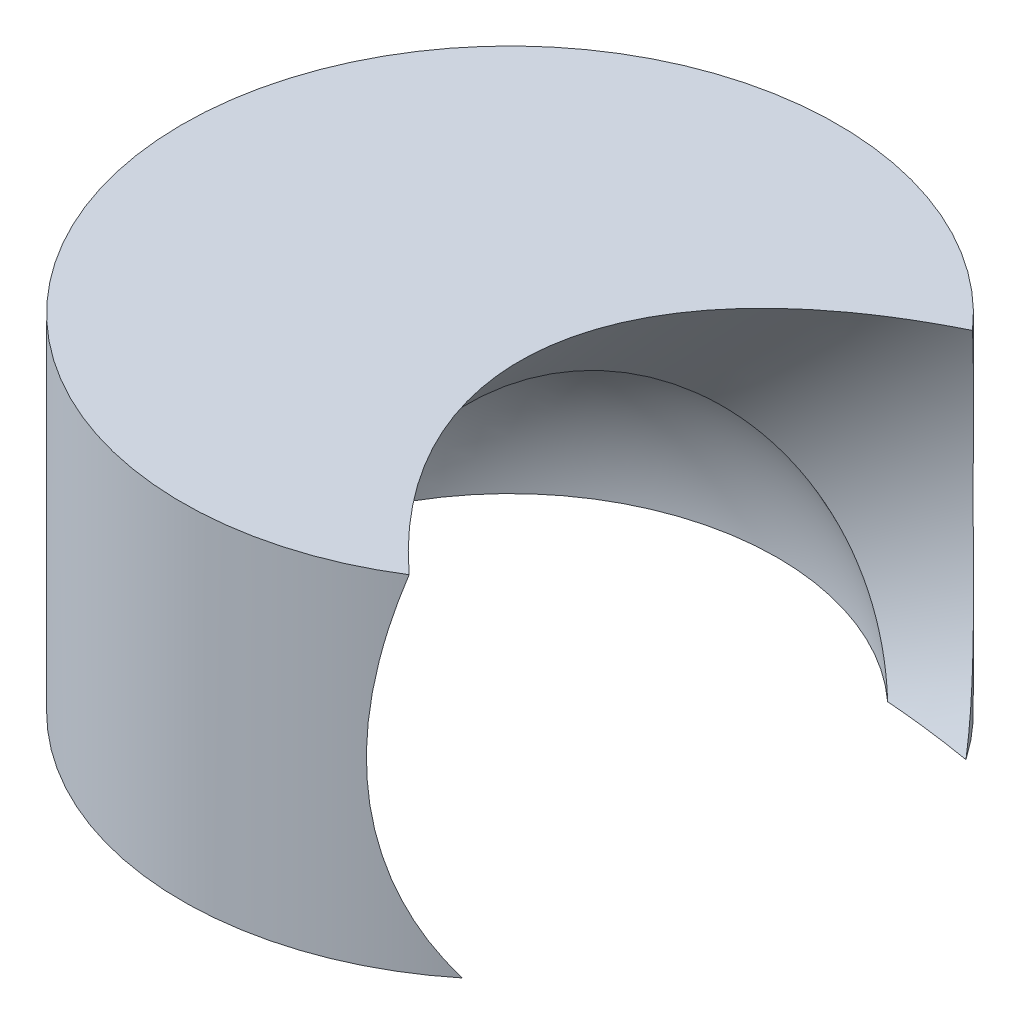
ISO-10303-21;
HEADER;
FILE_DESCRIPTION(('STEP AP214'),'2;1');
FILE_NAME('part.step','',(''),(''),'','','');
FILE_SCHEMA(('AUTOMOTIVE_DESIGN { 1 0 10303 214 1 1 1 1 }'));
ENDSEC;
DATA;
#1=APPLICATION_CONTEXT('core data for automotive mechanical design processes');
#2=APPLICATION_PROTOCOL_DEFINITION('international standard','automotive_design',2000,#1);
#3=PRODUCT_CONTEXT('',#1,'mechanical');
#4=PRODUCT('Part','Part','',(#3));
#5=PRODUCT_RELATED_PRODUCT_CATEGORY('part','',(#4));
#6=PRODUCT_DEFINITION_FORMATION('','',#4);
#7=PRODUCT_DEFINITION_CONTEXT('part definition',#1,'design');
#8=PRODUCT_DEFINITION('design','',#6,#7);
#9=PRODUCT_DEFINITION_SHAPE('','',#8);
#10=(LENGTH_UNIT() NAMED_UNIT(*) SI_UNIT(.MILLI.,.METRE.));
#11=(NAMED_UNIT(*) PLANE_ANGLE_UNIT() SI_UNIT($,.RADIAN.));
#12=(NAMED_UNIT(*) SI_UNIT($,.STERADIAN.) SOLID_ANGLE_UNIT());
#13=UNCERTAINTY_MEASURE_WITH_UNIT(LENGTH_MEASURE(1.E-05),#10,'distance_accuracy_value','');
#14=(GEOMETRIC_REPRESENTATION_CONTEXT(3) GLOBAL_UNCERTAINTY_ASSIGNED_CONTEXT((#13)) GLOBAL_UNIT_ASSIGNED_CONTEXT((#10,
#11,#12)) REPRESENTATION_CONTEXT('',''));
#15=CARTESIAN_POINT('',(0.,0.,0.));
#16=DIRECTION('',(0.,0.,1.));
#17=DIRECTION('',(1.,0.,0.));
#18=AXIS2_PLACEMENT_3D('',#15,#16,#17);
#19=CARTESIAN_POINT('',(-82.2724133595217,-97.7,-15.));
#20=DIRECTION('',(0.,1.,0.));
#21=DIRECTION('',(0.,0.,1.));
#22=AXIS2_PLACEMENT_3D('',#19,#20,#21);
#23=CYLINDRICAL_SURFACE('',#22,3.8);
#24=CARTESIAN_POINT('',(-82.2724133595217,-97.,-15.));
#25=DIRECTION('',(0.,-1.,0.));
#26=DIRECTION('',(0.,0.,-1.));
#27=AXIS2_PLACEMENT_3D('',#24,#25,#26);
#28=CIRCLE('',#27,3.8);
#29=CARTESIAN_POINT('',(-80.2346484142775,-97.,-11.7925845252081));
#30=VERTEX_POINT('',#29);
#31=CARTESIAN_POINT('',(-79.4208360761548,-97.,-17.5116741422777));
#32=VERTEX_POINT('',#31);
#33=EDGE_CURVE('E47',#30,#32,#28,.T.);
#34=ORIENTED_EDGE('',*,*,#33,.T.);
#35=CARTESIAN_POINT('',(-79.4207904593027,-96.9998,-17.51162235118));
#36=CARTESIAN_POINT('',(-79.4369262194832,-97.0705546747354,-17.529942716842));
#37=CARTESIAN_POINT('',(-79.4526325529312,-97.1416227927386,-17.5474188700959));
#38=CARTESIAN_POINT('',(-79.4830068820868,-97.2843968994103,-17.5806429487578));
#39=CARTESIAN_POINT('',(-79.4976746731815,-97.3561030106608,-17.596390533939));
#40=CARTESIAN_POINT('',(-79.5399510327827,-97.5727136817751,-17.641086102033));
#41=CARTESIAN_POINT('',(-79.5657040388626,-97.7185595063866,-17.6673434890366));
#42=CARTESIAN_POINT('',(-79.6109327630899,-98.0158920594204,-17.7124834219657));
#43=CARTESIAN_POINT('',(-79.6302505518494,-98.1674313864205,-17.731182538714));
#44=CARTESIAN_POINT('',(-79.6592635940215,-98.4721704684842,-17.7589622394461));
#45=CARTESIAN_POINT('',(-79.6689752628782,-98.6253669371333,-17.7680592338353));
#46=CARTESIAN_POINT('',(-79.6744706398831,-98.8659999089151,-17.7732094047869));
#47=CARTESIAN_POINT('',(-79.6744580705941,-98.9532633070037,-17.7731991134858));
#48=CARTESIAN_POINT('',(-79.6699237880866,-99.1275942839114,-17.768946072486));
#49=CARTESIAN_POINT('',(-79.6654019533468,-99.2146618573899,-17.7647032087227));
#50=CARTESIAN_POINT('',(-79.6514849354616,-99.3874862827804,-17.751513350895));
#51=CARTESIAN_POINT('',(-79.6421218637592,-99.473247984399,-17.742597348031));
#52=CARTESIAN_POINT('',(-79.6183236497529,-99.6433678720104,-17.7195739487868));
#53=CARTESIAN_POINT('',(-79.6038889305033,-99.727726174454,-17.7054669854088));
#54=CARTESIAN_POINT('',(-79.5698058726259,-99.8952399752276,-17.671422636116));
#55=CARTESIAN_POINT('',(-79.5500998326725,-99.9783707074235,-17.6514204565739));
#56=CARTESIAN_POINT('',(-79.5059406509833,-100.141642311545,-17.6053110062388));
#57=CARTESIAN_POINT('',(-79.4814868573308,-100.22178277107,-17.5792028969366));
#58=CARTESIAN_POINT('',(-79.4285226937757,-100.378437216735,-17.5206829331851));
#59=CARTESIAN_POINT('',(-79.4000080208011,-100.454947239775,-17.4882643783919));
#60=CARTESIAN_POINT('',(-79.3399114430989,-100.603678553575,-17.4171460803157));
#61=CARTESIAN_POINT('',(-79.3083309961023,-100.675901856538,-17.3784493164117));
#62=CARTESIAN_POINT('',(-79.2550966273551,-100.790159616009,-17.3101794474463));
#63=CARTESIAN_POINT('',(-79.2340328268013,-100.83358075225,-17.2824403200197));
#64=CARTESIAN_POINT('',(-79.1914504990428,-100.918387540099,-17.2246248482954));
#65=CARTESIAN_POINT('',(-79.1699334919482,-100.959778804244,-17.1945556201363));
#66=CARTESIAN_POINT('',(-79.1482970942916,-101.0002,-17.1633070890017));
#67=B_SPLINE_CURVE_WITH_KNOTS('',3,(#35,#36,#37,#38,#39,#40,#41,#42,#43,#44,#45,#46,#47,#48,#49,
#50,#51,#52,#53,#54,#55,#56,#57,#58,#59,#60,#61,#62,#63,#64,#65,#66),.UNSPECIFIED.,.F.,.F.,(4,2,
2,2,2,2,2,2,2,2,2,2,2,2,2,4),(0.,0.224529608607515,0.449103331512415,0.899999438098977,
1.36126182999428,1.82173462355418,2.08334352968169,2.34495948616088,2.60486201655752,
2.86474287218569,3.12759392537991,3.39048109634728,3.65364893503415,3.91669224847528,
4.08360469898819,4.25002609611645),.UNSPECIFIED.);
#68=CARTESIAN_POINT('',(-79.1484041425032,-101.,-17.1634616733336));
#69=VERTEX_POINT('',#68);
#70=EDGE_CURVE('E65',#32,#69,#67,.T.);
#71=ORIENTED_EDGE('',*,*,#70,.T.);
#72=CARTESIAN_POINT('',(-82.2724133595217,-101.,-15.));
#73=DIRECTION('',(0.,-1.,0.));
#74=DIRECTION('',(0.,0.,-1.));
#75=AXIS2_PLACEMENT_3D('',#72,#73,#74);
#76=CIRCLE('',#75,3.8);
#77=CARTESIAN_POINT('',(-79.8758974920685,-101.,-12.0509812314864));
#78=VERTEX_POINT('',#77);
#79=EDGE_CURVE('E85',#78,#69,#76,.T.);
#80=ORIENTED_EDGE('',*,*,#79,.F.);
#81=CARTESIAN_POINT('',(-79.8757515721661,-101.0002,-12.0510998190801));
#82=CARTESIAN_POINT('',(-79.9187324942041,-100.941314470494,-12.0161596661977));
#83=CARTESIAN_POINT('',(-79.9607737867758,-100.880334472737,-11.9835604754787));
#84=CARTESIAN_POINT('',(-80.0421203511134,-100.754374278326,-11.9229308128146));
#85=CARTESIAN_POINT('',(-80.0814246426146,-100.689392664025,-11.8949019729807));
#86=CARTESIAN_POINT('',(-80.1561944542201,-100.556042110918,-11.8434718400634));
#87=CARTESIAN_POINT('',(-80.1916806155118,-100.487694636403,-11.8200450333706));
#88=CARTESIAN_POINT('',(-80.2582872747055,-100.347645833791,-11.7774452092828));
#89=CARTESIAN_POINT('',(-80.2894086838969,-100.275945209957,-11.7582713034635));
#90=CARTESIAN_POINT('',(-80.3467645054102,-100.129422236479,-11.723874171494));
#91=CARTESIAN_POINT('',(-80.3729830658612,-100.054590686642,-11.708663699603));
#92=CARTESIAN_POINT('',(-80.420020103535,-99.9025749564758,-11.6819626490187));
#93=CARTESIAN_POINT('',(-80.4408364300622,-99.8253898527917,-11.6704735513997));
#94=CARTESIAN_POINT('',(-80.4769106153219,-99.6693551529714,-11.6508818974913));
#95=CARTESIAN_POINT('',(-80.4921709705092,-99.5905063212864,-11.642777819975));
#96=CARTESIAN_POINT('',(-80.5172652372034,-99.4316928256814,-11.629591546817));
#97=CARTESIAN_POINT('',(-80.5270975251341,-99.3517278352348,-11.6245102552784));
#98=CARTESIAN_POINT('',(-80.5447869030997,-99.1563821489884,-11.6154089956451));
#99=CARTESIAN_POINT('',(-80.5499364918525,-99.0406874090679,-11.6128058459412));
#100=CARTESIAN_POINT('',(-80.551001814994,-98.8092431130935,-11.6122673948075));
#101=CARTESIAN_POINT('',(-80.5469121531169,-98.6934935645023,-11.6143348212687));
#102=CARTESIAN_POINT('',(-80.5309163732628,-98.4621048722977,-11.6225354664216));
#103=CARTESIAN_POINT('',(-80.5189696358879,-98.3464694469416,-11.6286898152432));
#104=CARTESIAN_POINT('',(-80.4885971699469,-98.1163673648676,-11.6446622588753));
#105=CARTESIAN_POINT('',(-80.4701728966108,-98.0019004515729,-11.6544795308113));
#106=CARTESIAN_POINT('',(-80.4210621704128,-97.7367003729433,-11.6813378193191));
#107=CARTESIAN_POINT('',(-80.3883355698651,-97.5864778116716,-11.6996938161132));
#108=CARTESIAN_POINT('',(-80.3340717268447,-97.3639688517672,-11.7314735876289));
#109=CARTESIAN_POINT('',(-80.3152421185966,-97.2906762454686,-11.7426993300624));
#110=CARTESIAN_POINT('',(-80.2760307382489,-97.14474722216,-11.7665833087369));
#111=CARTESIAN_POINT('',(-80.2556490695164,-97.0721107618106,-11.7792414496075));
#112=CARTESIAN_POINT('',(-80.234590161155,-96.9998,-11.7926215358648));
#113=B_SPLINE_CURVE_WITH_KNOTS('',3,(#81,#82,#83,#84,#85,#86,#87,#88,#89,#90,#91,#92,#93,#94,
#95,#96,#97,#98,#99,#100,#101,#102,#103,#104,#105,#106,#107,#108,#109,#110,#111,#112),
.UNSPECIFIED.,.F.,.F.,(4,2,2,2,2,2,2,2,2,2,2,2,2,2,2,4),(0.,0.242487812446113,0.4850620305984,
0.726250914982059,0.967389367841502,1.20929447541563,1.45129574114894,1.69318813428325,
1.93515284012408,2.28209096716266,2.62923177885391,2.97818149210646,3.3270528610776,
3.79116730720977,4.02064608070601,4.25010958426819),.UNSPECIFIED.);
#114=EDGE_CURVE('E100',#78,#30,#113,.T.);
#115=ORIENTED_EDGE('',*,*,#114,.T.);
#116=EDGE_LOOP('',(#34,#71,#80,#115));
#117=FACE_BOUND('',#116,.T.);
#118=ADVANCED_FACE('F41',(#117),#23,.T.);
#119=CARTESIAN_POINT('',(-82.2724133595217,-97.,-15.));
#120=DIRECTION('',(0.,-1.,0.));
#121=DIRECTION('',(0.,0.,-1.));
#122=AXIS2_PLACEMENT_3D('',#119,#120,#121);
#123=PLANE('',#122);
#124=ORIENTED_EDGE('',*,*,#33,.F.);
#125=CARTESIAN_POINT('',(-71.3162534697557,-97.,-13.4409654868627));
#126=DIRECTION('',(0.,-1.,0.));
#127=DIRECTION('',(0.990026908932881,0.,0.140878385811327));
#128=AXIS2_PLACEMENT_3D('',#125,#126,#127);
#129=ELLIPSE('',#128,10.5033012386468,5.02786274995613);
#130=EDGE_CURVE('E84',#30,#32,#129,.T.);
#131=ORIENTED_EDGE('',*,*,#130,.T.);
#132=EDGE_LOOP('',(#124,#131));
#133=FACE_BOUND('',#132,.T.);
#134=ADVANCED_FACE('F108',(#133),#123,.F.);
#135=CARTESIAN_POINT('',(-82.2724133595217,-101.,-15.));
#136=DIRECTION('',(0.,-1.,0.));
#137=DIRECTION('',(0.,0.,-1.));
#138=AXIS2_PLACEMENT_3D('',#135,#136,#137);
#139=PLANE('',#138);
#140=CARTESIAN_POINT('',(-79.8256121020381,-101.,-14.6518262196257));
#141=DIRECTION('',(0.,-1.,0.));
#142=DIRECTION('',(0.990026908932881,0.,0.140878385811327));
#143=AXIS2_PLACEMENT_3D('',#140,#141,#142);
#144=ELLIPSE('',#143,5.40311255334571,2.58643522865266);
#145=CARTESIAN_POINT('',(-80.9068417887553,-101.,-12.2169774910873));
#146=VERTEX_POINT('',#145);
#147=EDGE_CURVE('E57',#78,#146,#144,.T.);
#148=ORIENTED_EDGE('',*,*,#147,.F.);
#149=ORIENTED_EDGE('',*,*,#79,.T.);
#150=CARTESIAN_POINT('',(-80.1847308375046,-101.,-17.2916329739433));
#151=VERTEX_POINT('',#150);
#152=EDGE_CURVE('E71',#151,#69,#144,.T.);
#153=ORIENTED_EDGE('',*,*,#152,.F.);
#154=CARTESIAN_POINT('',(-82.2724133595217,-101.,-15.));
#155=DIRECTION('',(0.,-1.,0.));
#156=DIRECTION('',(0.,0.,-1.));
#157=AXIS2_PLACEMENT_3D('',#154,#155,#156);
#158=CIRCLE('',#157,3.1);
#159=EDGE_CURVE('E79',#146,#151,#158,.T.);
#160=ORIENTED_EDGE('',*,*,#159,.F.);
#161=EDGE_LOOP('',(#148,#149,#153,#160));
#162=FACE_BOUND('',#161,.T.);
#163=ADVANCED_FACE('F77',(#162),#139,.T.);
#164=CARTESIAN_POINT('',(-82.2724133595217,-101.,-15.));
#165=DIRECTION('',(0.,0.,-1.));
#166=DIRECTION('',(-1.,0.,0.));
#167=AXIS2_PLACEMENT_3D('',#164,#165,#166);
#168=SPHERICAL_SURFACE('',#167,3.1);
#169=ORIENTED_EDGE('',*,*,#159,.T.);
#170=CARTESIAN_POINT('',(-81.0461217534081,-100.208810505388,-14.8255017308676));
#171=DIRECTION('',(-0.834342962059054,-0.538308656109163,-0.118724944390263));
#172=DIRECTION('',(0.542143136161945,-0.840286153588461,0.));
#173=AXIS2_PLACEMENT_3D('',#170,#171,#172);
#174=CIRCLE('',#173,2.72942822482297);
#175=EDGE_CURVE('E11',#151,#146,#174,.F.);
#176=ORIENTED_EDGE('',*,*,#175,.T.);
#177=EDGE_LOOP('',(#169,#176));
#178=FACE_BOUND('',#177,.T.);
#179=ADVANCED_FACE('F82',(#178),#168,.F.);
#180=CARTESIAN_POINT('',(-82.2724133595217,-101.,-15.));
#181=DIRECTION('',(0.834342962059054,0.538308656109163,0.118724944390263));
#182=DIRECTION('',(-0.542143136161945,0.840286153588461,0.));
#183=AXIS2_PLACEMENT_3D('',#180,#181,#182);
#184=CONICAL_SURFACE('',#183,2.29999999999999,0.284261523704203);
#185=ORIENTED_EDGE('',*,*,#114,.F.);
#186=ORIENTED_EDGE('',*,*,#147,.T.);
#187=ORIENTED_EDGE('',*,*,#175,.F.);
#188=ORIENTED_EDGE('',*,*,#152,.T.);
#189=ORIENTED_EDGE('',*,*,#70,.F.);
#190=ORIENTED_EDGE('',*,*,#130,.F.);
#191=EDGE_LOOP('',(#185,#186,#187,#188,#189,#190));
#192=FACE_BOUND('',#191,.T.);
#193=ADVANCED_FACE('F75',(#192),#184,.F.);
#194=CLOSED_SHELL('',(#118,#134,#163,#179,#193));
#195=MANIFOLD_SOLID_BREP('B2',#194);
#196=ADVANCED_BREP_SHAPE_REPRESENTATION('',(#18,#195),#14);
#197=SHAPE_DEFINITION_REPRESENTATION(#9,#196);
ENDSEC;
END-ISO-10303-21;
